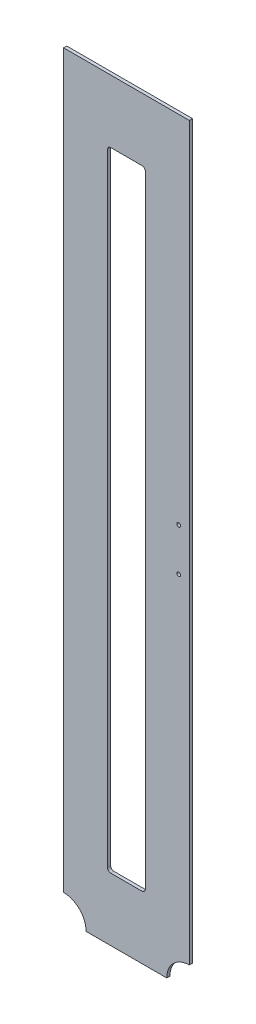
ISO-10303-21;
HEADER;
FILE_DESCRIPTION(('STEP AP214'),'2;1');
FILE_NAME('part.step','',(''),(''),'','','');
FILE_SCHEMA(('AUTOMOTIVE_DESIGN { 1 0 10303 214 1 1 1 1 }'));
ENDSEC;
DATA;
#1=APPLICATION_CONTEXT('core data for automotive mechanical design processes');
#2=APPLICATION_PROTOCOL_DEFINITION('international standard','automotive_design',2000,#1);
#3=PRODUCT_CONTEXT('',#1,'mechanical');
#4=PRODUCT('Part','Part','',(#3));
#5=PRODUCT_RELATED_PRODUCT_CATEGORY('part','',(#4));
#6=PRODUCT_DEFINITION_FORMATION('','',#4);
#7=PRODUCT_DEFINITION_CONTEXT('part definition',#1,'design');
#8=PRODUCT_DEFINITION('design','',#6,#7);
#9=PRODUCT_DEFINITION_SHAPE('','',#8);
#10=(LENGTH_UNIT() NAMED_UNIT(*) SI_UNIT(.MILLI.,.METRE.));
#11=(NAMED_UNIT(*) PLANE_ANGLE_UNIT() SI_UNIT($,.RADIAN.));
#12=(NAMED_UNIT(*) SI_UNIT($,.STERADIAN.) SOLID_ANGLE_UNIT());
#13=UNCERTAINTY_MEASURE_WITH_UNIT(LENGTH_MEASURE(1.E-05),#10,'distance_accuracy_value','');
#14=(GEOMETRIC_REPRESENTATION_CONTEXT(3) GLOBAL_UNCERTAINTY_ASSIGNED_CONTEXT((#13)) GLOBAL_UNIT_ASSIGNED_CONTEXT((#10,
#11,#12)) REPRESENTATION_CONTEXT('',''));
#15=CARTESIAN_POINT('',(0.,0.,0.));
#16=DIRECTION('',(0.,0.,1.));
#17=DIRECTION('',(1.,0.,0.));
#18=AXIS2_PLACEMENT_3D('',#15,#16,#17);
#19=CARTESIAN_POINT('',(100.,-600.,5.));
#20=DIRECTION('',(-1.,0.,0.));
#21=DIRECTION('',(0.,0.,1.));
#22=AXIS2_PLACEMENT_3D('',#19,#20,#21);
#23=PLANE('',#22);
#24=DIRECTION('',(0.,1.,0.));
#25=VECTOR('',#24,1.);
#26=CARTESIAN_POINT('',(100.,-600.,5.));
#27=LINE('',#26,#25);
#28=CARTESIAN_POINT('',(100.,-564.197190266493,5.));
#29=VERTEX_POINT('',#28);
#30=CARTESIAN_POINT('',(100.,600.,5.));
#31=VERTEX_POINT('',#30);
#32=EDGE_CURVE('E152',#29,#31,#27,.T.);
#33=ORIENTED_EDGE('',*,*,#32,.F.);
#34=DIRECTION('',(0.,0.,1.));
#35=VECTOR('',#34,1.);
#36=CARTESIAN_POINT('',(100.,-564.197190266493,0.));
#37=LINE('',#36,#35);
#38=CARTESIAN_POINT('',(100.,-564.197190266493,0.));
#39=VERTEX_POINT('',#38);
#40=EDGE_CURVE('E137',#39,#29,#37,.T.);
#41=ORIENTED_EDGE('',*,*,#40,.F.);
#42=DIRECTION('',(0.,1.,0.));
#43=VECTOR('',#42,1.);
#44=CARTESIAN_POINT('',(100.,-600.,0.));
#45=LINE('',#44,#43);
#46=CARTESIAN_POINT('',(100.,600.,0.));
#47=VERTEX_POINT('',#46);
#48=EDGE_CURVE('E150',#39,#47,#45,.T.);
#49=ORIENTED_EDGE('',*,*,#48,.T.);
#50=DIRECTION('',(0.,0.,-1.));
#51=VECTOR('',#50,1.);
#52=CARTESIAN_POINT('',(100.,600.,5.));
#53=LINE('',#52,#51);
#54=EDGE_CURVE('E172',#31,#47,#53,.T.);
#55=ORIENTED_EDGE('',*,*,#54,.F.);
#56=EDGE_LOOP('',(#33,#41,#49,#55));
#57=FACE_BOUND('',#56,.T.);
#58=ADVANCED_FACE('F33',(#57),#23,.F.);
#59=CARTESIAN_POINT('',(-100.,600.,5.));
#60=DIRECTION('',(0.,-1.,0.));
#61=DIRECTION('',(0.,0.,-1.));
#62=AXIS2_PLACEMENT_3D('',#59,#60,#61);
#63=PLANE('',#62);
#64=DIRECTION('',(-1.,0.,0.));
#65=VECTOR('',#64,1.);
#66=CARTESIAN_POINT('',(-100.,600.,0.));
#67=LINE('',#66,#65);
#68=CARTESIAN_POINT('',(-100.,600.,0.));
#69=VERTEX_POINT('',#68);
#70=EDGE_CURVE('E156',#47,#69,#67,.T.);
#71=ORIENTED_EDGE('',*,*,#70,.T.);
#72=DIRECTION('',(0.,0.,-1.));
#73=VECTOR('',#72,1.);
#74=CARTESIAN_POINT('',(-100.,600.,5.));
#75=LINE('',#74,#73);
#76=CARTESIAN_POINT('',(-100.,600.,5.));
#77=VERTEX_POINT('',#76);
#78=EDGE_CURVE('E169',#77,#69,#75,.T.);
#79=ORIENTED_EDGE('',*,*,#78,.F.);
#80=DIRECTION('',(-1.,0.,0.));
#81=VECTOR('',#80,1.);
#82=CARTESIAN_POINT('',(-100.,600.,5.));
#83=LINE('',#82,#81);
#84=EDGE_CURVE('E254',#31,#77,#83,.T.);
#85=ORIENTED_EDGE('',*,*,#84,.F.);
#86=ORIENTED_EDGE('',*,*,#54,.T.);
#87=EDGE_LOOP('',(#71,#79,#85,#86));
#88=FACE_BOUND('',#87,.T.);
#89=ADVANCED_FACE('F270',(#88),#63,.F.);
#90=CARTESIAN_POINT('',(-100.,-600.,5.));
#91=DIRECTION('',(1.,0.,0.));
#92=DIRECTION('',(0.,0.,-1.));
#93=AXIS2_PLACEMENT_3D('',#90,#91,#92);
#94=PLANE('',#93);
#95=DIRECTION('',(0.,-1.,0.));
#96=VECTOR('',#95,1.);
#97=CARTESIAN_POINT('',(-100.,-600.,0.));
#98=LINE('',#97,#96);
#99=CARTESIAN_POINT('',(-100.,-564.197190266493,0.));
#100=VERTEX_POINT('',#99);
#101=EDGE_CURVE('E159',#69,#100,#98,.T.);
#102=ORIENTED_EDGE('',*,*,#101,.T.);
#103=DIRECTION('',(0.,0.,1.));
#104=VECTOR('',#103,1.);
#105=CARTESIAN_POINT('',(-100.,-564.197190266493,0.));
#106=LINE('',#105,#104);
#107=CARTESIAN_POINT('',(-100.,-564.197190266493,5.));
#108=VERTEX_POINT('',#107);
#109=EDGE_CURVE('E242',#100,#108,#106,.T.);
#110=ORIENTED_EDGE('',*,*,#109,.T.);
#111=DIRECTION('',(0.,-1.,0.));
#112=VECTOR('',#111,1.);
#113=CARTESIAN_POINT('',(-100.,-600.,5.));
#114=LINE('',#113,#112);
#115=EDGE_CURVE('E255',#77,#108,#114,.T.);
#116=ORIENTED_EDGE('',*,*,#115,.F.);
#117=ORIENTED_EDGE('',*,*,#78,.T.);
#118=EDGE_LOOP('',(#102,#110,#116,#117));
#119=FACE_BOUND('',#118,.T.);
#120=ADVANCED_FACE('F266',(#119),#94,.F.);
#121=CARTESIAN_POINT('',(-100.,-600.,5.));
#122=DIRECTION('',(0.,1.,0.));
#123=DIRECTION('',(0.,0.,1.));
#124=AXIS2_PLACEMENT_3D('',#121,#122,#123);
#125=PLANE('',#124);
#126=DIRECTION('',(1.,0.,0.));
#127=VECTOR('',#126,1.);
#128=CARTESIAN_POINT('',(-100.,-600.,0.));
#129=LINE('',#128,#127);
#130=CARTESIAN_POINT('',(-64.1971902664933,-600.,0.));
#131=VERTEX_POINT('',#130);
#132=CARTESIAN_POINT('',(64.1971902664933,-600.,0.));
#133=VERTEX_POINT('',#132);
#134=EDGE_CURVE('E167',#131,#133,#129,.T.);
#135=ORIENTED_EDGE('',*,*,#134,.T.);
#136=DIRECTION('',(0.,0.,1.));
#137=VECTOR('',#136,1.);
#138=CARTESIAN_POINT('',(64.1971902664933,-600.,0.));
#139=LINE('',#138,#137);
#140=CARTESIAN_POINT('',(64.1971902664933,-600.,5.));
#141=VERTEX_POINT('',#140);
#142=EDGE_CURVE('E140',#133,#141,#139,.T.);
#143=ORIENTED_EDGE('',*,*,#142,.T.);
#144=DIRECTION('',(1.,0.,0.));
#145=VECTOR('',#144,1.);
#146=CARTESIAN_POINT('',(-100.,-600.,5.));
#147=LINE('',#146,#145);
#148=CARTESIAN_POINT('',(-64.1971902664933,-600.,5.));
#149=VERTEX_POINT('',#148);
#150=EDGE_CURVE('E162',#149,#141,#147,.T.);
#151=ORIENTED_EDGE('',*,*,#150,.F.);
#152=DIRECTION('',(0.,0.,1.));
#153=VECTOR('',#152,1.);
#154=CARTESIAN_POINT('',(-64.1971902664933,-600.,0.));
#155=LINE('',#154,#153);
#156=EDGE_CURVE('E248',#131,#149,#155,.T.);
#157=ORIENTED_EDGE('',*,*,#156,.F.);
#158=EDGE_LOOP('',(#135,#143,#151,#157));
#159=FACE_BOUND('',#158,.T.);
#160=ADVANCED_FACE('F263',(#159),#125,.F.);
#161=CARTESIAN_POINT('',(0.,0.,5.));
#162=DIRECTION('',(0.,0.,-1.));
#163=DIRECTION('',(-1.,0.,0.));
#164=AXIS2_PLACEMENT_3D('',#161,#162,#163);
#165=PLANE('',#164);
#166=CARTESIAN_POINT('',(83.1932254378304,-33.9999999999975,5.));
#167=DIRECTION('',(0.,0.,1.));
#168=DIRECTION('',(1.,0.,0.));
#169=AXIS2_PLACEMENT_3D('',#166,#167,#168);
#170=CIRCLE('',#169,3.00000000000001);
#171=CARTESIAN_POINT('',(86.1932254378304,-33.9999999999975,5.));
#172=VERTEX_POINT('',#171);
#173=EDGE_CURVE('E317',#172,#172,#170,.T.);
#174=ORIENTED_EDGE('',*,*,#173,.F.);
#175=EDGE_LOOP('',(#174));
#176=FACE_BOUND('',#175,.T.);
#177=CARTESIAN_POINT('',(83.19322543783,34.0000000000026,5.));
#178=DIRECTION('',(0.,0.,1.));
#179=DIRECTION('',(1.,0.,0.));
#180=AXIS2_PLACEMENT_3D('',#177,#178,#179);
#181=CIRCLE('',#180,3.00000000000001);
#182=CARTESIAN_POINT('',(86.19322543783,34.0000000000026,5.));
#183=VERTEX_POINT('',#182);
#184=EDGE_CURVE('E311',#183,#183,#181,.T.);
#185=ORIENTED_EDGE('',*,*,#184,.F.);
#186=EDGE_LOOP('',(#185));
#187=FACE_BOUND('',#186,.T.);
#188=DIRECTION('',(-1.,0.,0.));
#189=VECTOR('',#188,1.);
#190=CARTESIAN_POINT('',(-30.,500.,5.));
#191=LINE('',#190,#189);
#192=CARTESIAN_POINT('',(25.,500.,5.));
#193=VERTEX_POINT('',#192);
#194=CARTESIAN_POINT('',(-25.,500.,5.));
#195=VERTEX_POINT('',#194);
#196=EDGE_CURVE('E208',#193,#195,#191,.T.);
#197=ORIENTED_EDGE('',*,*,#196,.F.);
#198=CARTESIAN_POINT('',(25.,495.,5.));
#199=DIRECTION('',(0.,0.,-1.));
#200=DIRECTION('',(-1.,0.,0.));
#201=AXIS2_PLACEMENT_3D('',#198,#199,#200);
#202=CIRCLE('',#201,5.);
#203=CARTESIAN_POINT('',(30.,495.,5.));
#204=VERTEX_POINT('',#203);
#205=EDGE_CURVE('E201',#193,#204,#202,.T.);
#206=ORIENTED_EDGE('',*,*,#205,.T.);
#207=DIRECTION('',(0.,1.,0.));
#208=VECTOR('',#207,1.);
#209=CARTESIAN_POINT('',(30.,-500.,5.));
#210=LINE('',#209,#208);
#211=CARTESIAN_POINT('',(30.,-495.,5.));
#212=VERTEX_POINT('',#211);
#213=EDGE_CURVE('E215',#212,#204,#210,.T.);
#214=ORIENTED_EDGE('',*,*,#213,.F.);
#215=CARTESIAN_POINT('',(25.,-495.,5.));
#216=DIRECTION('',(0.,0.,-1.));
#217=DIRECTION('',(-1.,0.,0.));
#218=AXIS2_PLACEMENT_3D('',#215,#216,#217);
#219=CIRCLE('',#218,5.);
#220=CARTESIAN_POINT('',(25.,-500.,5.));
#221=VERTEX_POINT('',#220);
#222=EDGE_CURVE('E197',#212,#221,#219,.T.);
#223=ORIENTED_EDGE('',*,*,#222,.T.);
#224=DIRECTION('',(1.,0.,0.));
#225=VECTOR('',#224,1.);
#226=CARTESIAN_POINT('',(-30.,-500.,5.));
#227=LINE('',#226,#225);
#228=CARTESIAN_POINT('',(-25.,-500.,5.));
#229=VERTEX_POINT('',#228);
#230=EDGE_CURVE('E239',#229,#221,#227,.T.);
#231=ORIENTED_EDGE('',*,*,#230,.F.);
#232=CARTESIAN_POINT('',(-25.,-495.,5.));
#233=DIRECTION('',(0.,0.,-1.));
#234=DIRECTION('',(-1.,0.,0.));
#235=AXIS2_PLACEMENT_3D('',#232,#233,#234);
#236=CIRCLE('',#235,5.);
#237=CARTESIAN_POINT('',(-30.,-495.,5.));
#238=VERTEX_POINT('',#237);
#239=EDGE_CURVE('E193',#229,#238,#236,.T.);
#240=ORIENTED_EDGE('',*,*,#239,.T.);
#241=DIRECTION('',(0.,-1.,0.));
#242=VECTOR('',#241,1.);
#243=CARTESIAN_POINT('',(-30.,-500.,5.));
#244=LINE('',#243,#242);
#245=CARTESIAN_POINT('',(-30.,495.,5.));
#246=VERTEX_POINT('',#245);
#247=EDGE_CURVE('E210',#246,#238,#244,.T.);
#248=ORIENTED_EDGE('',*,*,#247,.F.);
#249=CARTESIAN_POINT('',(-25.,495.,5.));
#250=DIRECTION('',(0.,0.,-1.));
#251=DIRECTION('',(-1.,0.,0.));
#252=AXIS2_PLACEMENT_3D('',#249,#250,#251);
#253=CIRCLE('',#252,5.);
#254=EDGE_CURVE('E41',#246,#195,#253,.T.);
#255=ORIENTED_EDGE('',*,*,#254,.T.);
#256=EDGE_LOOP('',(#197,#206,#214,#223,#231,#240,#248,#255));
#257=FACE_BOUND('',#256,.T.);
#258=ORIENTED_EDGE('',*,*,#150,.T.);
#259=CARTESIAN_POINT('',(100.,-600.,5.));
#260=DIRECTION('',(0.,0.,1.));
#261=DIRECTION('',(1.,0.,0.));
#262=AXIS2_PLACEMENT_3D('',#259,#260,#261);
#263=CIRCLE('',#262,35.8028097335067);
#264=EDGE_CURVE('E145',#29,#141,#263,.T.);
#265=ORIENTED_EDGE('',*,*,#264,.F.);
#266=ORIENTED_EDGE('',*,*,#32,.T.);
#267=ORIENTED_EDGE('',*,*,#84,.T.);
#268=ORIENTED_EDGE('',*,*,#115,.T.);
#269=CARTESIAN_POINT('',(-100.,-600.,5.));
#270=DIRECTION('',(0.,0.,1.));
#271=DIRECTION('',(-1.,0.,0.));
#272=AXIS2_PLACEMENT_3D('',#269,#270,#271);
#273=CIRCLE('',#272,35.8028097335067);
#274=EDGE_CURVE('E229',#149,#108,#273,.T.);
#275=ORIENTED_EDGE('',*,*,#274,.F.);
#276=EDGE_LOOP('',(#258,#265,#266,#267,#268,#275));
#277=FACE_BOUND('',#276,.T.);
#278=ADVANCED_FACE('F206',(#176,#187,#257,#277),#165,.F.);
#279=CARTESIAN_POINT('',(0.,0.,0.));
#280=DIRECTION('',(0.,0.,-1.));
#281=DIRECTION('',(-1.,0.,0.));
#282=AXIS2_PLACEMENT_3D('',#279,#280,#281);
#283=PLANE('',#282);
#284=CARTESIAN_POINT('',(83.1932254378304,-33.9999999999975,0.));
#285=DIRECTION('',(0.,0.,1.));
#286=DIRECTION('',(1.,0.,0.));
#287=AXIS2_PLACEMENT_3D('',#284,#285,#286);
#288=CIRCLE('',#287,3.00000000000001);
#289=CARTESIAN_POINT('',(86.1932254378304,-33.9999999999975,0.));
#290=VERTEX_POINT('',#289);
#291=EDGE_CURVE('E236',#290,#290,#288,.T.);
#292=ORIENTED_EDGE('',*,*,#291,.T.);
#293=EDGE_LOOP('',(#292));
#294=FACE_BOUND('',#293,.T.);
#295=CARTESIAN_POINT('',(83.19322543783,34.0000000000026,0.));
#296=DIRECTION('',(0.,0.,1.));
#297=DIRECTION('',(1.,0.,0.));
#298=AXIS2_PLACEMENT_3D('',#295,#296,#297);
#299=CIRCLE('',#298,3.00000000000001);
#300=CARTESIAN_POINT('',(86.19322543783,34.0000000000026,0.));
#301=VERTEX_POINT('',#300);
#302=EDGE_CURVE('E314',#301,#301,#299,.T.);
#303=ORIENTED_EDGE('',*,*,#302,.T.);
#304=EDGE_LOOP('',(#303));
#305=FACE_BOUND('',#304,.T.);
#306=DIRECTION('',(1.,0.,0.));
#307=VECTOR('',#306,1.);
#308=CARTESIAN_POINT('',(-30.,-500.,0.));
#309=LINE('',#308,#307);
#310=CARTESIAN_POINT('',(-25.,-500.,0.));
#311=VERTEX_POINT('',#310);
#312=CARTESIAN_POINT('',(25.,-500.,0.));
#313=VERTEX_POINT('',#312);
#314=EDGE_CURVE('E227',#311,#313,#309,.T.);
#315=ORIENTED_EDGE('',*,*,#314,.T.);
#316=CARTESIAN_POINT('',(25.,-495.,0.));
#317=DIRECTION('',(0.,0.,-1.));
#318=DIRECTION('',(-1.,0.,0.));
#319=AXIS2_PLACEMENT_3D('',#316,#317,#318);
#320=CIRCLE('',#319,5.);
#321=CARTESIAN_POINT('',(30.,-495.,0.));
#322=VERTEX_POINT('',#321);
#323=EDGE_CURVE('E199',#313,#322,#320,.F.);
#324=ORIENTED_EDGE('',*,*,#323,.T.);
#325=DIRECTION('',(0.,1.,0.));
#326=VECTOR('',#325,1.);
#327=CARTESIAN_POINT('',(30.,-500.,0.));
#328=LINE('',#327,#326);
#329=CARTESIAN_POINT('',(30.,495.,0.));
#330=VERTEX_POINT('',#329);
#331=EDGE_CURVE('E231',#322,#330,#328,.T.);
#332=ORIENTED_EDGE('',*,*,#331,.T.);
#333=CARTESIAN_POINT('',(25.,495.,0.));
#334=DIRECTION('',(0.,0.,-1.));
#335=DIRECTION('',(-1.,0.,0.));
#336=AXIS2_PLACEMENT_3D('',#333,#334,#335);
#337=CIRCLE('',#336,5.);
#338=CARTESIAN_POINT('',(25.,500.,0.));
#339=VERTEX_POINT('',#338);
#340=EDGE_CURVE('E55',#330,#339,#337,.F.);
#341=ORIENTED_EDGE('',*,*,#340,.T.);
#342=DIRECTION('',(-1.,0.,0.));
#343=VECTOR('',#342,1.);
#344=CARTESIAN_POINT('',(-30.,500.,0.));
#345=LINE('',#344,#343);
#346=CARTESIAN_POINT('',(-25.,500.,0.));
#347=VERTEX_POINT('',#346);
#348=EDGE_CURVE('E223',#339,#347,#345,.T.);
#349=ORIENTED_EDGE('',*,*,#348,.T.);
#350=CARTESIAN_POINT('',(-25.,495.,0.));
#351=DIRECTION('',(0.,0.,-1.));
#352=DIRECTION('',(-1.,0.,0.));
#353=AXIS2_PLACEMENT_3D('',#350,#351,#352);
#354=CIRCLE('',#353,5.);
#355=CARTESIAN_POINT('',(-30.,495.,0.));
#356=VERTEX_POINT('',#355);
#357=EDGE_CURVE('E11',#347,#356,#354,.F.);
#358=ORIENTED_EDGE('',*,*,#357,.T.);
#359=DIRECTION('',(0.,-1.,0.));
#360=VECTOR('',#359,1.);
#361=CARTESIAN_POINT('',(-30.,-500.,0.));
#362=LINE('',#361,#360);
#363=CARTESIAN_POINT('',(-30.,-495.,0.));
#364=VERTEX_POINT('',#363);
#365=EDGE_CURVE('E221',#356,#364,#362,.T.);
#366=ORIENTED_EDGE('',*,*,#365,.T.);
#367=CARTESIAN_POINT('',(-25.,-495.,0.));
#368=DIRECTION('',(0.,0.,-1.));
#369=DIRECTION('',(-1.,0.,0.));
#370=AXIS2_PLACEMENT_3D('',#367,#368,#369);
#371=CIRCLE('',#370,5.);
#372=EDGE_CURVE('E195',#364,#311,#371,.F.);
#373=ORIENTED_EDGE('',*,*,#372,.T.);
#374=EDGE_LOOP('',(#315,#324,#332,#341,#349,#358,#366,#373));
#375=FACE_BOUND('',#374,.T.);
#376=CARTESIAN_POINT('',(100.,-600.,0.));
#377=DIRECTION('',(0.,0.,1.));
#378=DIRECTION('',(1.,0.,0.));
#379=AXIS2_PLACEMENT_3D('',#376,#377,#378);
#380=CIRCLE('',#379,35.8028097335067);
#381=EDGE_CURVE('E134',#39,#133,#380,.T.);
#382=ORIENTED_EDGE('',*,*,#381,.T.);
#383=ORIENTED_EDGE('',*,*,#134,.F.);
#384=CARTESIAN_POINT('',(-100.,-600.,0.));
#385=DIRECTION('',(0.,0.,1.));
#386=DIRECTION('',(-1.,0.,0.));
#387=AXIS2_PLACEMENT_3D('',#384,#385,#386);
#388=CIRCLE('',#387,35.8028097335067);
#389=EDGE_CURVE('E245',#131,#100,#388,.T.);
#390=ORIENTED_EDGE('',*,*,#389,.T.);
#391=ORIENTED_EDGE('',*,*,#101,.F.);
#392=ORIENTED_EDGE('',*,*,#70,.F.);
#393=ORIENTED_EDGE('',*,*,#48,.F.);
#394=EDGE_LOOP('',(#382,#383,#390,#391,#392,#393));
#395=FACE_BOUND('',#394,.T.);
#396=ADVANCED_FACE('F154',(#294,#305,#375,#395),#283,.T.);
#397=CARTESIAN_POINT('',(-100.,-600.,0.));
#398=DIRECTION('',(0.,0.,1.));
#399=DIRECTION('',(1.,0.,0.));
#400=AXIS2_PLACEMENT_3D('',#397,#398,#399);
#401=CYLINDRICAL_SURFACE('',#400,35.8028097335067);
#402=ORIENTED_EDGE('',*,*,#274,.T.);
#403=ORIENTED_EDGE('',*,*,#109,.F.);
#404=ORIENTED_EDGE('',*,*,#389,.F.);
#405=ORIENTED_EDGE('',*,*,#156,.T.);
#406=EDGE_LOOP('',(#402,#403,#404,#405));
#407=FACE_BOUND('',#406,.T.);
#408=ADVANCED_FACE('F353',(#407),#401,.F.);
#409=CARTESIAN_POINT('',(100.,-600.,0.));
#410=DIRECTION('',(0.,0.,1.));
#411=DIRECTION('',(1.,0.,0.));
#412=AXIS2_PLACEMENT_3D('',#409,#410,#411);
#413=CYLINDRICAL_SURFACE('',#412,35.8028097335067);
#414=ORIENTED_EDGE('',*,*,#264,.T.);
#415=ORIENTED_EDGE('',*,*,#142,.F.);
#416=ORIENTED_EDGE('',*,*,#381,.F.);
#417=ORIENTED_EDGE('',*,*,#40,.T.);
#418=EDGE_LOOP('',(#414,#415,#416,#417));
#419=FACE_BOUND('',#418,.T.);
#420=ADVANCED_FACE('F136',(#419),#413,.F.);
#421=CARTESIAN_POINT('',(30.,-500.,0.));
#422=DIRECTION('',(1.,0.,0.));
#423=DIRECTION('',(0.,0.,-1.));
#424=AXIS2_PLACEMENT_3D('',#421,#422,#423);
#425=PLANE('',#424);
#426=ORIENTED_EDGE('',*,*,#331,.F.);
#427=DIRECTION('',(0.,0.,1.));
#428=VECTOR('',#427,1.);
#429=CARTESIAN_POINT('',(30.,-495.,5.));
#430=LINE('',#429,#428);
#431=EDGE_CURVE('E186',#322,#212,#430,.T.);
#432=ORIENTED_EDGE('',*,*,#431,.T.);
#433=ORIENTED_EDGE('',*,*,#213,.T.);
#434=DIRECTION('',(0.,0.,1.));
#435=VECTOR('',#434,1.);
#436=CARTESIAN_POINT('',(30.,495.,0.));
#437=LINE('',#436,#435);
#438=EDGE_CURVE('E184',#204,#330,#437,.F.);
#439=ORIENTED_EDGE('',*,*,#438,.T.);
#440=EDGE_LOOP('',(#426,#432,#433,#439));
#441=FACE_BOUND('',#440,.T.);
#442=ADVANCED_FACE('F301',(#441),#425,.F.);
#443=CARTESIAN_POINT('',(-30.,-500.,0.));
#444=DIRECTION('',(0.,-1.,0.));
#445=DIRECTION('',(0.,0.,-1.));
#446=AXIS2_PLACEMENT_3D('',#443,#444,#445);
#447=PLANE('',#446);
#448=ORIENTED_EDGE('',*,*,#314,.F.);
#449=DIRECTION('',(0.,0.,1.));
#450=VECTOR('',#449,1.);
#451=CARTESIAN_POINT('',(-25.,-500.,5.));
#452=LINE('',#451,#450);
#453=EDGE_CURVE('E176',#311,#229,#452,.T.);
#454=ORIENTED_EDGE('',*,*,#453,.T.);
#455=ORIENTED_EDGE('',*,*,#230,.T.);
#456=DIRECTION('',(0.,0.,1.));
#457=VECTOR('',#456,1.);
#458=CARTESIAN_POINT('',(25.,-500.,0.));
#459=LINE('',#458,#457);
#460=EDGE_CURVE('E174',#221,#313,#459,.F.);
#461=ORIENTED_EDGE('',*,*,#460,.T.);
#462=EDGE_LOOP('',(#448,#454,#455,#461));
#463=FACE_BOUND('',#462,.T.);
#464=ADVANCED_FACE('F308',(#463),#447,.F.);
#465=CARTESIAN_POINT('',(-30.,-500.,0.));
#466=DIRECTION('',(-1.,0.,0.));
#467=DIRECTION('',(0.,0.,1.));
#468=AXIS2_PLACEMENT_3D('',#465,#466,#467);
#469=PLANE('',#468);
#470=ORIENTED_EDGE('',*,*,#247,.T.);
#471=DIRECTION('',(0.,0.,1.));
#472=VECTOR('',#471,1.);
#473=CARTESIAN_POINT('',(-30.,-495.,0.));
#474=LINE('',#473,#472);
#475=EDGE_CURVE('E182',#238,#364,#474,.F.);
#476=ORIENTED_EDGE('',*,*,#475,.T.);
#477=ORIENTED_EDGE('',*,*,#365,.F.);
#478=DIRECTION('',(0.,0.,1.));
#479=VECTOR('',#478,1.);
#480=CARTESIAN_POINT('',(-30.,495.,5.));
#481=LINE('',#480,#479);
#482=EDGE_CURVE('E179',#356,#246,#481,.T.);
#483=ORIENTED_EDGE('',*,*,#482,.T.);
#484=EDGE_LOOP('',(#470,#476,#477,#483));
#485=FACE_BOUND('',#484,.T.);
#486=ADVANCED_FACE('F225',(#485),#469,.F.);
#487=CARTESIAN_POINT('',(-30.,500.,0.));
#488=DIRECTION('',(0.,1.,0.));
#489=DIRECTION('',(0.,0.,1.));
#490=AXIS2_PLACEMENT_3D('',#487,#488,#489);
#491=PLANE('',#490);
#492=ORIENTED_EDGE('',*,*,#348,.F.);
#493=DIRECTION('',(0.,0.,1.));
#494=VECTOR('',#493,1.);
#495=CARTESIAN_POINT('',(25.,500.,5.));
#496=LINE('',#495,#494);
#497=EDGE_CURVE('E190',#339,#193,#496,.T.);
#498=ORIENTED_EDGE('',*,*,#497,.T.);
#499=ORIENTED_EDGE('',*,*,#196,.T.);
#500=DIRECTION('',(0.,0.,1.));
#501=VECTOR('',#500,1.);
#502=CARTESIAN_POINT('',(-25.,500.,0.));
#503=LINE('',#502,#501);
#504=EDGE_CURVE('E48',#195,#347,#503,.F.);
#505=ORIENTED_EDGE('',*,*,#504,.T.);
#506=EDGE_LOOP('',(#492,#498,#499,#505));
#507=FACE_BOUND('',#506,.T.);
#508=ADVANCED_FACE('F213',(#507),#491,.F.);
#509=CARTESIAN_POINT('',(-25.,-495.,0.));
#510=DIRECTION('',(0.,0.,-1.));
#511=DIRECTION('',(-1.,0.,0.));
#512=AXIS2_PLACEMENT_3D('',#509,#510,#511);
#513=CYLINDRICAL_SURFACE('',#512,5.);
#514=ORIENTED_EDGE('',*,*,#372,.F.);
#515=ORIENTED_EDGE('',*,*,#475,.F.);
#516=ORIENTED_EDGE('',*,*,#239,.F.);
#517=ORIENTED_EDGE('',*,*,#453,.F.);
#518=EDGE_LOOP('',(#514,#515,#516,#517));
#519=FACE_BOUND('',#518,.T.);
#520=ADVANCED_FACE('F283',(#519),#513,.F.);
#521=CARTESIAN_POINT('',(25.,-495.,0.));
#522=DIRECTION('',(0.,0.,-1.));
#523=DIRECTION('',(-1.,0.,0.));
#524=AXIS2_PLACEMENT_3D('',#521,#522,#523);
#525=CYLINDRICAL_SURFACE('',#524,5.);
#526=ORIENTED_EDGE('',*,*,#323,.F.);
#527=ORIENTED_EDGE('',*,*,#460,.F.);
#528=ORIENTED_EDGE('',*,*,#222,.F.);
#529=ORIENTED_EDGE('',*,*,#431,.F.);
#530=EDGE_LOOP('',(#526,#527,#528,#529));
#531=FACE_BOUND('',#530,.T.);
#532=ADVANCED_FACE('F286',(#531),#525,.F.);
#533=CARTESIAN_POINT('',(25.,495.,0.));
#534=DIRECTION('',(0.,0.,-1.));
#535=DIRECTION('',(-1.,0.,0.));
#536=AXIS2_PLACEMENT_3D('',#533,#534,#535);
#537=CYLINDRICAL_SURFACE('',#536,5.);
#538=ORIENTED_EDGE('',*,*,#340,.F.);
#539=ORIENTED_EDGE('',*,*,#438,.F.);
#540=ORIENTED_EDGE('',*,*,#205,.F.);
#541=ORIENTED_EDGE('',*,*,#497,.F.);
#542=EDGE_LOOP('',(#538,#539,#540,#541));
#543=FACE_BOUND('',#542,.T.);
#544=ADVANCED_FACE('F289',(#543),#537,.F.);
#545=CARTESIAN_POINT('',(-25.,495.,0.));
#546=DIRECTION('',(0.,0.,-1.));
#547=DIRECTION('',(-1.,0.,0.));
#548=AXIS2_PLACEMENT_3D('',#545,#546,#547);
#549=CYLINDRICAL_SURFACE('',#548,5.);
#550=ORIENTED_EDGE('',*,*,#357,.F.);
#551=ORIENTED_EDGE('',*,*,#504,.F.);
#552=ORIENTED_EDGE('',*,*,#254,.F.);
#553=ORIENTED_EDGE('',*,*,#482,.F.);
#554=EDGE_LOOP('',(#550,#551,#552,#553));
#555=FACE_BOUND('',#554,.T.);
#556=ADVANCED_FACE('F35',(#555),#549,.F.);
#557=CARTESIAN_POINT('',(83.19322543783,34.0000000000026,0.));
#558=DIRECTION('',(0.,0.,1.));
#559=DIRECTION('',(1.,0.,0.));
#560=AXIS2_PLACEMENT_3D('',#557,#558,#559);
#561=CYLINDRICAL_SURFACE('',#560,3.00000000000001);
#562=ORIENTED_EDGE('',*,*,#302,.F.);
#563=EDGE_LOOP('',(#562));
#564=FACE_BOUND('',#563,.T.);
#565=ORIENTED_EDGE('',*,*,#184,.T.);
#566=EDGE_LOOP('',(#565));
#567=FACE_BOUND('',#566,.T.);
#568=ADVANCED_FACE('F296',(#564,#567),#561,.F.);
#569=CARTESIAN_POINT('',(83.1932254378304,-33.9999999999975,0.));
#570=DIRECTION('',(0.,0.,1.));
#571=DIRECTION('',(1.,0.,0.));
#572=AXIS2_PLACEMENT_3D('',#569,#570,#571);
#573=CYLINDRICAL_SURFACE('',#572,3.00000000000001);
#574=ORIENTED_EDGE('',*,*,#291,.F.);
#575=EDGE_LOOP('',(#574));
#576=FACE_BOUND('',#575,.T.);
#577=ORIENTED_EDGE('',*,*,#173,.T.);
#578=EDGE_LOOP('',(#577));
#579=FACE_BOUND('',#578,.T.);
#580=ADVANCED_FACE('F325',(#576,#579),#573,.F.);
#581=CLOSED_SHELL('',(#58,#89,#120,#160,#278,#396,#408,#420,#442,#464,#486,#508,#520,#532,#544,
#556,#568,#580));
#582=MANIFOLD_SOLID_BREP('B2',#581);
#583=ADVANCED_BREP_SHAPE_REPRESENTATION('',(#18,#582),#14);
#584=SHAPE_DEFINITION_REPRESENTATION(#9,#583);
ENDSEC;
END-ISO-10303-21;
